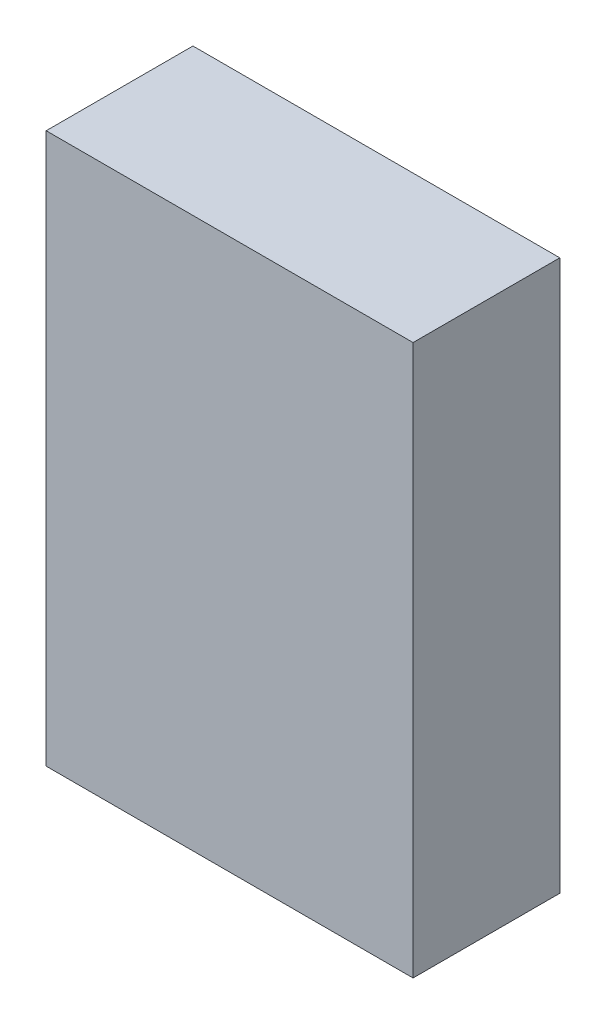
ISO-10303-21;
HEADER;
FILE_DESCRIPTION(('STEP AP214'),'2;1');
FILE_NAME('part.step','',(''),(''),'','','');
FILE_SCHEMA(('AUTOMOTIVE_DESIGN { 1 0 10303 214 1 1 1 1 }'));
ENDSEC;
DATA;
#1=APPLICATION_CONTEXT('core data for automotive mechanical design processes');
#2=APPLICATION_PROTOCOL_DEFINITION('international standard','automotive_design',2000,#1);
#3=PRODUCT_CONTEXT('',#1,'mechanical');
#4=PRODUCT('Part','Part','',(#3));
#5=PRODUCT_RELATED_PRODUCT_CATEGORY('part','',(#4));
#6=PRODUCT_DEFINITION_FORMATION('','',#4);
#7=PRODUCT_DEFINITION_CONTEXT('part definition',#1,'design');
#8=PRODUCT_DEFINITION('design','',#6,#7);
#9=PRODUCT_DEFINITION_SHAPE('','',#8);
#10=(LENGTH_UNIT() NAMED_UNIT(*) SI_UNIT(.MILLI.,.METRE.));
#11=(NAMED_UNIT(*) PLANE_ANGLE_UNIT() SI_UNIT($,.RADIAN.));
#12=(NAMED_UNIT(*) SI_UNIT($,.STERADIAN.) SOLID_ANGLE_UNIT());
#13=UNCERTAINTY_MEASURE_WITH_UNIT(LENGTH_MEASURE(1.E-05),#10,'distance_accuracy_value','');
#14=(GEOMETRIC_REPRESENTATION_CONTEXT(3) GLOBAL_UNCERTAINTY_ASSIGNED_CONTEXT((#13)) GLOBAL_UNIT_ASSIGNED_CONTEXT((#10,
#11,#12)) REPRESENTATION_CONTEXT('',''));
#15=CARTESIAN_POINT('',(0.,0.,0.));
#16=DIRECTION('',(0.,0.,1.));
#17=DIRECTION('',(1.,0.,0.));
#18=AXIS2_PLACEMENT_3D('',#15,#16,#17);
#19=CARTESIAN_POINT('',(-56.6260359487677,31.2883435582822,80.));
#20=DIRECTION('',(1.,0.,0.));
#21=DIRECTION('',(0.,1.,0.));
#22=AXIS2_PLACEMENT_3D('',#19,#20,#21);
#23=PLANE('',#22);
#24=DIRECTION('',(0.,-1.,0.));
#25=VECTOR('',#24,1.);
#26=CARTESIAN_POINT('',(-56.6260359487677,31.2883435582822,0.));
#27=LINE('',#26,#25);
#28=CARTESIAN_POINT('',(-56.6260359487677,31.2883435582822,0.));
#29=VERTEX_POINT('',#28);
#30=CARTESIAN_POINT('',(-56.6260359487677,-268.711656441718,0.));
#31=VERTEX_POINT('',#30);
#32=EDGE_CURVE('E181',#29,#31,#27,.T.);
#33=ORIENTED_EDGE('',*,*,#32,.T.);
#34=DIRECTION('',(0.,0.,-1.));
#35=VECTOR('',#34,1.);
#36=CARTESIAN_POINT('',(-56.6260359487677,-268.711656441718,80.));
#37=LINE('',#36,#35);
#38=CARTESIAN_POINT('',(-56.6260359487677,-268.711656441718,80.));
#39=VERTEX_POINT('',#38);
#40=EDGE_CURVE('E225',#39,#31,#37,.T.);
#41=ORIENTED_EDGE('',*,*,#40,.F.);
#42=DIRECTION('',(0.,-1.,0.));
#43=VECTOR('',#42,1.);
#44=CARTESIAN_POINT('',(-56.6260359487677,31.2883435582822,80.));
#45=LINE('',#44,#43);
#46=CARTESIAN_POINT('',(-56.6260359487677,31.2883435582822,80.));
#47=VERTEX_POINT('',#46);
#48=EDGE_CURVE('E199',#47,#39,#45,.T.);
#49=ORIENTED_EDGE('',*,*,#48,.F.);
#50=DIRECTION('',(0.,0.,-1.));
#51=VECTOR('',#50,1.);
#52=CARTESIAN_POINT('',(-56.6260359487677,31.2883435582822,80.));
#53=LINE('',#52,#51);
#54=EDGE_CURVE('E209',#47,#29,#53,.T.);
#55=ORIENTED_EDGE('',*,*,#54,.T.);
#56=EDGE_LOOP('',(#33,#41,#49,#55));
#57=FACE_BOUND('',#56,.T.);
#58=ADVANCED_FACE('F41',(#57),#23,.F.);
#59=CARTESIAN_POINT('',(-56.6260359487677,-268.711656441718,80.));
#60=DIRECTION('',(0.,1.,0.));
#61=DIRECTION('',(0.,0.,1.));
#62=AXIS2_PLACEMENT_3D('',#59,#60,#61);
#63=PLANE('',#62);
#64=DIRECTION('',(1.,0.,0.));
#65=VECTOR('',#64,1.);
#66=CARTESIAN_POINT('',(-56.6260359487677,-268.711656441718,0.));
#67=LINE('',#66,#65);
#68=CARTESIAN_POINT('',(143.373964051232,-268.711656441718,0.));
#69=VERTEX_POINT('',#68);
#70=EDGE_CURVE('E212',#31,#69,#67,.T.);
#71=ORIENTED_EDGE('',*,*,#70,.T.);
#72=DIRECTION('',(0.,0.,-1.));
#73=VECTOR('',#72,1.);
#74=CARTESIAN_POINT('',(143.373964051232,-268.711656441718,80.));
#75=LINE('',#74,#73);
#76=CARTESIAN_POINT('',(143.373964051232,-268.711656441718,80.));
#77=VERTEX_POINT('',#76);
#78=EDGE_CURVE('E222',#77,#69,#75,.T.);
#79=ORIENTED_EDGE('',*,*,#78,.F.);
#80=DIRECTION('',(1.,0.,0.));
#81=VECTOR('',#80,1.);
#82=CARTESIAN_POINT('',(-56.6260359487677,-268.711656441718,80.));
#83=LINE('',#82,#81);
#84=EDGE_CURVE('E202',#39,#77,#83,.T.);
#85=ORIENTED_EDGE('',*,*,#84,.F.);
#86=ORIENTED_EDGE('',*,*,#40,.T.);
#87=EDGE_LOOP('',(#71,#79,#85,#86));
#88=FACE_BOUND('',#87,.T.);
#89=ADVANCED_FACE('F292',(#88),#63,.F.);
#90=CARTESIAN_POINT('',(143.373964051232,31.2883435582822,80.));
#91=DIRECTION('',(-1.,0.,0.));
#92=DIRECTION('',(0.,-1.,0.));
#93=AXIS2_PLACEMENT_3D('',#90,#91,#92);
#94=PLANE('',#93);
#95=DIRECTION('',(0.,1.,0.));
#96=VECTOR('',#95,1.);
#97=CARTESIAN_POINT('',(143.373964051232,31.2883435582822,0.));
#98=LINE('',#97,#96);
#99=CARTESIAN_POINT('',(143.373964051232,31.2883435582822,0.));
#100=VERTEX_POINT('',#99);
#101=EDGE_CURVE('E214',#69,#100,#98,.T.);
#102=ORIENTED_EDGE('',*,*,#101,.T.);
#103=DIRECTION('',(0.,0.,-1.));
#104=VECTOR('',#103,1.);
#105=CARTESIAN_POINT('',(143.373964051232,31.2883435582822,80.));
#106=LINE('',#105,#104);
#107=CARTESIAN_POINT('',(143.373964051232,31.2883435582822,80.));
#108=VERTEX_POINT('',#107);
#109=EDGE_CURVE('E219',#108,#100,#106,.T.);
#110=ORIENTED_EDGE('',*,*,#109,.F.);
#111=DIRECTION('',(0.,1.,0.));
#112=VECTOR('',#111,1.);
#113=CARTESIAN_POINT('',(143.373964051232,31.2883435582822,80.));
#114=LINE('',#113,#112);
#115=EDGE_CURVE('E205',#77,#108,#114,.T.);
#116=ORIENTED_EDGE('',*,*,#115,.F.);
#117=ORIENTED_EDGE('',*,*,#78,.T.);
#118=EDGE_LOOP('',(#102,#110,#116,#117));
#119=FACE_BOUND('',#118,.T.);
#120=ADVANCED_FACE('F297',(#119),#94,.F.);
#121=CARTESIAN_POINT('',(-56.6260359487677,31.2883435582822,80.));
#122=DIRECTION('',(0.,-1.,0.));
#123=DIRECTION('',(0.,0.,-1.));
#124=AXIS2_PLACEMENT_3D('',#121,#122,#123);
#125=PLANE('',#124);
#126=DIRECTION('',(-1.,0.,0.));
#127=VECTOR('',#126,1.);
#128=CARTESIAN_POINT('',(-56.6260359487677,31.2883435582822,0.));
#129=LINE('',#128,#127);
#130=EDGE_CURVE('E203',#100,#29,#129,.T.);
#131=ORIENTED_EDGE('',*,*,#130,.T.);
#132=ORIENTED_EDGE('',*,*,#54,.F.);
#133=DIRECTION('',(-1.,0.,0.));
#134=VECTOR('',#133,1.);
#135=CARTESIAN_POINT('',(-56.6260359487677,31.2883435582822,80.));
#136=LINE('',#135,#134);
#137=EDGE_CURVE('E207',#108,#47,#136,.T.);
#138=ORIENTED_EDGE('',*,*,#137,.F.);
#139=ORIENTED_EDGE('',*,*,#109,.T.);
#140=EDGE_LOOP('',(#131,#132,#138,#139));
#141=FACE_BOUND('',#140,.T.);
#142=ADVANCED_FACE('F314',(#141),#125,.F.);
#143=CARTESIAN_POINT('',(0.,0.,80.));
#144=DIRECTION('',(0.,0.,1.));
#145=DIRECTION('',(1.,0.,0.));
#146=AXIS2_PLACEMENT_3D('',#143,#144,#145);
#147=PLANE('',#146);
#148=ORIENTED_EDGE('',*,*,#48,.T.);
#149=ORIENTED_EDGE('',*,*,#84,.T.);
#150=ORIENTED_EDGE('',*,*,#115,.T.);
#151=ORIENTED_EDGE('',*,*,#137,.T.);
#152=EDGE_LOOP('',(#148,#149,#150,#151));
#153=FACE_BOUND('',#152,.T.);
#154=ADVANCED_FACE('F310',(#153),#147,.T.);
#155=CARTESIAN_POINT('',(0.,0.,0.));
#156=DIRECTION('',(0.,0.,1.));
#157=DIRECTION('',(1.,0.,0.));
#158=AXIS2_PLACEMENT_3D('',#155,#156,#157);
#159=PLANE('',#158);
#160=DIRECTION('',(0.,1.,0.));
#161=VECTOR('',#160,1.);
#162=CARTESIAN_POINT('',(-54.7260359487677,-266.811656441718,0.));
#163=LINE('',#162,#161);
#164=CARTESIAN_POINT('',(-54.7260359487677,-266.811656441718,0.));
#165=VERTEX_POINT('',#164);
#166=CARTESIAN_POINT('',(-54.7260359487677,29.3883435582822,0.));
#167=VERTEX_POINT('',#166);
#168=EDGE_CURVE('E161',#165,#167,#163,.T.);
#169=ORIENTED_EDGE('',*,*,#168,.F.);
#170=DIRECTION('',(-1.,0.,0.));
#171=VECTOR('',#170,1.);
#172=CARTESIAN_POINT('',(141.473964051232,-266.811656441718,0.));
#173=LINE('',#172,#171);
#174=CARTESIAN_POINT('',(141.473964051232,-266.811656441718,0.));
#175=VERTEX_POINT('',#174);
#176=EDGE_CURVE('E55',#175,#165,#173,.T.);
#177=ORIENTED_EDGE('',*,*,#176,.F.);
#178=DIRECTION('',(0.,-1.,0.));
#179=VECTOR('',#178,1.);
#180=CARTESIAN_POINT('',(141.473964051232,29.3883435582822,0.));
#181=LINE('',#180,#179);
#182=CARTESIAN_POINT('',(141.473964051232,29.3883435582822,0.));
#183=VERTEX_POINT('',#182);
#184=EDGE_CURVE('E149',#183,#175,#181,.T.);
#185=ORIENTED_EDGE('',*,*,#184,.F.);
#186=DIRECTION('',(1.,0.,0.));
#187=VECTOR('',#186,1.);
#188=CARTESIAN_POINT('',(-54.7260359487677,29.3883435582822,0.));
#189=LINE('',#188,#187);
#190=EDGE_CURVE('E152',#167,#183,#189,.T.);
#191=ORIENTED_EDGE('',*,*,#190,.F.);
#192=EDGE_LOOP('',(#169,#177,#185,#191));
#193=FACE_BOUND('',#192,.T.);
#194=ORIENTED_EDGE('',*,*,#32,.F.);
#195=ORIENTED_EDGE('',*,*,#130,.F.);
#196=ORIENTED_EDGE('',*,*,#101,.F.);
#197=ORIENTED_EDGE('',*,*,#70,.F.);
#198=EDGE_LOOP('',(#194,#195,#196,#197));
#199=FACE_BOUND('',#198,.T.);
#200=ADVANCED_FACE('F305',(#193,#199),#159,.F.);
#201=CARTESIAN_POINT('',(141.473964051232,-266.811656441718,4.1));
#202=DIRECTION('',(0.,-1.,0.));
#203=DIRECTION('',(0.,0.,-1.));
#204=AXIS2_PLACEMENT_3D('',#201,#202,#203);
#205=PLANE('',#204);
#206=ORIENTED_EDGE('',*,*,#176,.T.);
#207=DIRECTION('',(0.,0.,-1.));
#208=VECTOR('',#207,1.);
#209=CARTESIAN_POINT('',(-54.7260359487677,-266.811656441718,4.1));
#210=LINE('',#209,#208);
#211=CARTESIAN_POINT('',(-54.7260359487677,-266.811656441718,4.1));
#212=VERTEX_POINT('',#211);
#213=EDGE_CURVE('E127',#212,#165,#210,.T.);
#214=ORIENTED_EDGE('',*,*,#213,.F.);
#215=DIRECTION('',(-1.,0.,0.));
#216=VECTOR('',#215,1.);
#217=CARTESIAN_POINT('',(141.473964051232,-266.811656441718,4.1));
#218=LINE('',#217,#216);
#219=CARTESIAN_POINT('',(141.473964051232,-266.811656441718,4.1));
#220=VERTEX_POINT('',#219);
#221=EDGE_CURVE('E131',#220,#212,#218,.T.);
#222=ORIENTED_EDGE('',*,*,#221,.F.);
#223=DIRECTION('',(0.,0.,-1.));
#224=VECTOR('',#223,1.);
#225=CARTESIAN_POINT('',(141.473964051232,-266.811656441718,4.1));
#226=LINE('',#225,#224);
#227=EDGE_CURVE('E165',#220,#175,#226,.T.);
#228=ORIENTED_EDGE('',*,*,#227,.T.);
#229=EDGE_LOOP('',(#206,#214,#222,#228));
#230=FACE_BOUND('',#229,.T.);
#231=ADVANCED_FACE('F129',(#230),#205,.F.);
#232=CARTESIAN_POINT('',(141.473964051232,29.3883435582822,4.1));
#233=DIRECTION('',(1.,0.,0.));
#234=DIRECTION('',(0.,1.,0.));
#235=AXIS2_PLACEMENT_3D('',#232,#233,#234);
#236=PLANE('',#235);
#237=ORIENTED_EDGE('',*,*,#184,.T.);
#238=ORIENTED_EDGE('',*,*,#227,.F.);
#239=DIRECTION('',(0.,-1.,0.));
#240=VECTOR('',#239,1.);
#241=CARTESIAN_POINT('',(141.473964051232,29.3883435582822,4.1));
#242=LINE('',#241,#240);
#243=CARTESIAN_POINT('',(141.473964051232,29.3883435582822,4.1));
#244=VERTEX_POINT('',#243);
#245=EDGE_CURVE('E137',#244,#220,#242,.T.);
#246=ORIENTED_EDGE('',*,*,#245,.F.);
#247=DIRECTION('',(0.,0.,-1.));
#248=VECTOR('',#247,1.);
#249=CARTESIAN_POINT('',(141.473964051232,29.3883435582822,4.1));
#250=LINE('',#249,#248);
#251=EDGE_CURVE('E167',#244,#183,#250,.T.);
#252=ORIENTED_EDGE('',*,*,#251,.T.);
#253=EDGE_LOOP('',(#237,#238,#246,#252));
#254=FACE_BOUND('',#253,.T.);
#255=ADVANCED_FACE('F342',(#254),#236,.F.);
#256=CARTESIAN_POINT('',(-54.7260359487677,29.3883435582822,4.1));
#257=DIRECTION('',(0.,1.,0.));
#258=DIRECTION('',(0.,0.,1.));
#259=AXIS2_PLACEMENT_3D('',#256,#257,#258);
#260=PLANE('',#259);
#261=ORIENTED_EDGE('',*,*,#190,.T.);
#262=ORIENTED_EDGE('',*,*,#251,.F.);
#263=DIRECTION('',(1.,0.,0.));
#264=VECTOR('',#263,1.);
#265=CARTESIAN_POINT('',(-54.7260359487677,29.3883435582822,4.1));
#266=LINE('',#265,#264);
#267=CARTESIAN_POINT('',(-54.7260359487677,29.3883435582822,4.1));
#268=VERTEX_POINT('',#267);
#269=EDGE_CURVE('E145',#268,#244,#266,.T.);
#270=ORIENTED_EDGE('',*,*,#269,.F.);
#271=DIRECTION('',(0.,0.,-1.));
#272=VECTOR('',#271,1.);
#273=CARTESIAN_POINT('',(-54.7260359487677,29.3883435582822,4.1));
#274=LINE('',#273,#272);
#275=EDGE_CURVE('E136',#268,#167,#274,.T.);
#276=ORIENTED_EDGE('',*,*,#275,.T.);
#277=EDGE_LOOP('',(#261,#262,#270,#276));
#278=FACE_BOUND('',#277,.T.);
#279=ADVANCED_FACE('F350',(#278),#260,.F.);
#280=CARTESIAN_POINT('',(-54.7260359487677,-266.811656441718,4.1));
#281=DIRECTION('',(-1.,0.,0.));
#282=DIRECTION('',(0.,-1.,0.));
#283=AXIS2_PLACEMENT_3D('',#280,#281,#282);
#284=PLANE('',#283);
#285=ORIENTED_EDGE('',*,*,#168,.T.);
#286=ORIENTED_EDGE('',*,*,#275,.F.);
#287=DIRECTION('',(0.,1.,0.));
#288=VECTOR('',#287,1.);
#289=CARTESIAN_POINT('',(-54.7260359487677,-266.811656441718,4.1));
#290=LINE('',#289,#288);
#291=EDGE_CURVE('E140',#212,#268,#290,.T.);
#292=ORIENTED_EDGE('',*,*,#291,.F.);
#293=ORIENTED_EDGE('',*,*,#213,.T.);
#294=EDGE_LOOP('',(#285,#286,#292,#293));
#295=FACE_BOUND('',#294,.T.);
#296=ADVANCED_FACE('F141',(#295),#284,.F.);
#297=CARTESIAN_POINT('',(0.,0.,4.1));
#298=DIRECTION('',(0.,0.,-1.));
#299=DIRECTION('',(-1.,0.,0.));
#300=AXIS2_PLACEMENT_3D('',#297,#298,#299);
#301=PLANE('',#300);
#302=DIRECTION('',(-1.,0.,0.));
#303=VECTOR('',#302,1.);
#304=CARTESIAN_POINT('',(-56.6260359487677,-264.711656441718,4.10000000000001));
#305=LINE('',#304,#303);
#306=CARTESIAN_POINT('',(139.373964051232,-264.711656441718,4.10000000000001));
#307=VERTEX_POINT('',#306);
#308=CARTESIAN_POINT('',(-52.6260359487677,-264.711656441718,4.10000000000001));
#309=VERTEX_POINT('',#308);
#310=EDGE_CURVE('E171',#307,#309,#305,.T.);
#311=ORIENTED_EDGE('',*,*,#310,.F.);
#312=DIRECTION('',(0.,-1.,0.));
#313=VECTOR('',#312,1.);
#314=CARTESIAN_POINT('',(139.373964051232,31.2883435582822,4.10000000000001));
#315=LINE('',#314,#313);
#316=CARTESIAN_POINT('',(139.373964051232,27.2883435582822,4.10000000000001));
#317=VERTEX_POINT('',#316);
#318=EDGE_CURVE('E63',#317,#307,#315,.T.);
#319=ORIENTED_EDGE('',*,*,#318,.F.);
#320=DIRECTION('',(1.,0.,0.));
#321=VECTOR('',#320,1.);
#322=CARTESIAN_POINT('',(-56.6260359487677,27.2883435582822,4.10000000000001));
#323=LINE('',#322,#321);
#324=CARTESIAN_POINT('',(-52.6260359487677,27.2883435582822,4.10000000000001));
#325=VERTEX_POINT('',#324);
#326=EDGE_CURVE('E228',#325,#317,#323,.T.);
#327=ORIENTED_EDGE('',*,*,#326,.F.);
#328=DIRECTION('',(0.,1.,0.));
#329=VECTOR('',#328,1.);
#330=CARTESIAN_POINT('',(-52.6260359487677,31.2883435582822,4.10000000000001));
#331=LINE('',#330,#329);
#332=EDGE_CURVE('E174',#309,#325,#331,.T.);
#333=ORIENTED_EDGE('',*,*,#332,.F.);
#334=EDGE_LOOP('',(#311,#319,#327,#333));
#335=FACE_BOUND('',#334,.T.);
#336=ORIENTED_EDGE('',*,*,#221,.T.);
#337=ORIENTED_EDGE('',*,*,#291,.T.);
#338=ORIENTED_EDGE('',*,*,#269,.T.);
#339=ORIENTED_EDGE('',*,*,#245,.T.);
#340=EDGE_LOOP('',(#336,#337,#338,#339));
#341=FACE_BOUND('',#340,.T.);
#342=ADVANCED_FACE('F147',(#335,#341),#301,.T.);
#343=CARTESIAN_POINT('',(0.,0.,76.));
#344=DIRECTION('',(0.,0.,1.));
#345=DIRECTION('',(1.,0.,0.));
#346=AXIS2_PLACEMENT_3D('',#343,#344,#345);
#347=PLANE('',#346);
#348=CARTESIAN_POINT('',(119.373964051232,-244.711656441718,76.));
#349=DIRECTION('',(0.,0.,1.));
#350=DIRECTION('',(1.,0.,0.));
#351=AXIS2_PLACEMENT_3D('',#348,#349,#350);
#352=CIRCLE('',#351,9.00000000000001);
#353=CARTESIAN_POINT('',(128.373964051232,-244.711656441718,76.));
#354=VERTEX_POINT('',#353);
#355=EDGE_CURVE('E11',#354,#354,#352,.F.);
#356=ORIENTED_EDGE('',*,*,#355,.F.);
#357=EDGE_LOOP('',(#356));
#358=FACE_BOUND('',#357,.T.);
#359=CARTESIAN_POINT('',(-32.6260359487677,-244.711656441718,76.));
#360=DIRECTION('',(0.,0.,1.));
#361=DIRECTION('',(1.,0.,0.));
#362=AXIS2_PLACEMENT_3D('',#359,#360,#361);
#363=CIRCLE('',#362,9.00000000000001);
#364=CARTESIAN_POINT('',(-23.6260359487677,-244.711656441718,76.));
#365=VERTEX_POINT('',#364);
#366=EDGE_CURVE('E48',#365,#365,#363,.F.);
#367=ORIENTED_EDGE('',*,*,#366,.F.);
#368=EDGE_LOOP('',(#367));
#369=FACE_BOUND('',#368,.T.);
#370=CARTESIAN_POINT('',(-32.6260359487677,7.28834355828224,76.));
#371=DIRECTION('',(0.,0.,1.));
#372=DIRECTION('',(1.,0.,0.));
#373=AXIS2_PLACEMENT_3D('',#370,#371,#372);
#374=CIRCLE('',#373,9.);
#375=CARTESIAN_POINT('',(-23.6260359487677,7.28834355828224,76.));
#376=VERTEX_POINT('',#375);
#377=EDGE_CURVE('E245',#376,#376,#374,.F.);
#378=ORIENTED_EDGE('',*,*,#377,.F.);
#379=EDGE_LOOP('',(#378));
#380=FACE_BOUND('',#379,.T.);
#381=CARTESIAN_POINT('',(89.3739640512323,-174.711656441718,76.));
#382=DIRECTION('',(0.,0.,1.));
#383=DIRECTION('',(1.,0.,0.));
#384=AXIS2_PLACEMENT_3D('',#381,#382,#383);
#385=CIRCLE('',#384,9.00000000000001);
#386=CARTESIAN_POINT('',(98.3739640512324,-174.711656441718,76.));
#387=VERTEX_POINT('',#386);
#388=EDGE_CURVE('E242',#387,#387,#385,.F.);
#389=ORIENTED_EDGE('',*,*,#388,.F.);
#390=EDGE_LOOP('',(#389));
#391=FACE_BOUND('',#390,.T.);
#392=CARTESIAN_POINT('',(-2.62603594876769,-62.7116564417177,76.));
#393=DIRECTION('',(0.,0.,1.));
#394=DIRECTION('',(1.,0.,0.));
#395=AXIS2_PLACEMENT_3D('',#392,#393,#394);
#396=CIRCLE('',#395,9.00000000000001);
#397=CARTESIAN_POINT('',(6.37396405123232,-62.7116564417177,76.));
#398=VERTEX_POINT('',#397);
#399=EDGE_CURVE('E239',#398,#398,#396,.F.);
#400=ORIENTED_EDGE('',*,*,#399,.F.);
#401=EDGE_LOOP('',(#400));
#402=FACE_BOUND('',#401,.T.);
#403=CARTESIAN_POINT('',(-2.62603594876769,-174.711656441718,76.));
#404=DIRECTION('',(0.,0.,1.));
#405=DIRECTION('',(1.,0.,0.));
#406=AXIS2_PLACEMENT_3D('',#403,#404,#405);
#407=CIRCLE('',#406,9.00000000000002);
#408=CARTESIAN_POINT('',(6.37396405123233,-174.711656441718,76.));
#409=VERTEX_POINT('',#408);
#410=EDGE_CURVE('E236',#409,#409,#407,.F.);
#411=ORIENTED_EDGE('',*,*,#410,.F.);
#412=EDGE_LOOP('',(#411));
#413=FACE_BOUND('',#412,.T.);
#414=CARTESIAN_POINT('',(89.3739640512323,-62.7116564417177,76.));
#415=DIRECTION('',(0.,0.,1.));
#416=DIRECTION('',(1.,0.,0.));
#417=AXIS2_PLACEMENT_3D('',#414,#415,#416);
#418=CIRCLE('',#417,9.00000000000001);
#419=CARTESIAN_POINT('',(98.3739640512324,-62.7116564417177,76.));
#420=VERTEX_POINT('',#419);
#421=EDGE_CURVE('E233',#420,#420,#418,.F.);
#422=ORIENTED_EDGE('',*,*,#421,.F.);
#423=EDGE_LOOP('',(#422));
#424=FACE_BOUND('',#423,.T.);
#425=CARTESIAN_POINT('',(119.373964051232,7.28834355828225,76.));
#426=DIRECTION('',(0.,0.,1.));
#427=DIRECTION('',(1.,0.,0.));
#428=AXIS2_PLACEMENT_3D('',#425,#426,#427);
#429=CIRCLE('',#428,9.00000000000001);
#430=CARTESIAN_POINT('',(128.373964051232,7.28834355828225,76.));
#431=VERTEX_POINT('',#430);
#432=EDGE_CURVE('E230',#431,#431,#429,.F.);
#433=ORIENTED_EDGE('',*,*,#432,.F.);
#434=EDGE_LOOP('',(#433));
#435=FACE_BOUND('',#434,.T.);
#436=DIRECTION('',(0.,-1.,0.));
#437=VECTOR('',#436,1.);
#438=CARTESIAN_POINT('',(-52.6260359487677,31.2883435582822,76.));
#439=LINE('',#438,#437);
#440=CARTESIAN_POINT('',(-52.6260359487677,27.2883435582822,76.));
#441=VERTEX_POINT('',#440);
#442=CARTESIAN_POINT('',(-52.6260359487677,-264.711656441718,76.));
#443=VERTEX_POINT('',#442);
#444=EDGE_CURVE('E177',#441,#443,#439,.T.);
#445=ORIENTED_EDGE('',*,*,#444,.F.);
#446=DIRECTION('',(-1.,0.,0.));
#447=VECTOR('',#446,1.);
#448=CARTESIAN_POINT('',(-56.6260359487677,27.2883435582822,76.));
#449=LINE('',#448,#447);
#450=CARTESIAN_POINT('',(139.373964051232,27.2883435582822,76.));
#451=VERTEX_POINT('',#450);
#452=EDGE_CURVE('E190',#451,#441,#449,.T.);
#453=ORIENTED_EDGE('',*,*,#452,.F.);
#454=DIRECTION('',(0.,1.,0.));
#455=VECTOR('',#454,1.);
#456=CARTESIAN_POINT('',(139.373964051232,31.2883435582822,76.));
#457=LINE('',#456,#455);
#458=CARTESIAN_POINT('',(139.373964051232,-264.711656441718,76.));
#459=VERTEX_POINT('',#458);
#460=EDGE_CURVE('E194',#459,#451,#457,.T.);
#461=ORIENTED_EDGE('',*,*,#460,.F.);
#462=DIRECTION('',(1.,0.,0.));
#463=VECTOR('',#462,1.);
#464=CARTESIAN_POINT('',(-56.6260359487677,-264.711656441718,76.));
#465=LINE('',#464,#463);
#466=EDGE_CURVE('E185',#443,#459,#465,.T.);
#467=ORIENTED_EDGE('',*,*,#466,.F.);
#468=EDGE_LOOP('',(#445,#453,#461,#467));
#469=FACE_BOUND('',#468,.T.);
#470=ADVANCED_FACE('F252',(#358,#369,#380,#391,#402,#413,#424,#435,#469),#347,.F.);
#471=CARTESIAN_POINT('',(-56.6260359487677,27.2883435582822,80.));
#472=DIRECTION('',(0.,-1.,0.));
#473=DIRECTION('',(0.,0.,-1.));
#474=AXIS2_PLACEMENT_3D('',#471,#472,#473);
#475=PLANE('',#474);
#476=DIRECTION('',(0.,0.,-1.));
#477=VECTOR('',#476,1.);
#478=CARTESIAN_POINT('',(-52.6260359487677,27.2883435582822,80.));
#479=LINE('',#478,#477);
#480=EDGE_CURVE('E186',#441,#325,#479,.T.);
#481=ORIENTED_EDGE('',*,*,#480,.T.);
#482=ORIENTED_EDGE('',*,*,#326,.T.);
#483=DIRECTION('',(0.,0.,-1.));
#484=VECTOR('',#483,1.);
#485=CARTESIAN_POINT('',(139.373964051232,27.2883435582822,80.));
#486=LINE('',#485,#484);
#487=EDGE_CURVE('E189',#451,#317,#486,.T.);
#488=ORIENTED_EDGE('',*,*,#487,.F.);
#489=ORIENTED_EDGE('',*,*,#452,.T.);
#490=EDGE_LOOP('',(#481,#482,#488,#489));
#491=FACE_BOUND('',#490,.T.);
#492=ADVANCED_FACE('F255',(#491),#475,.T.);
#493=CARTESIAN_POINT('',(139.373964051232,31.2883435582822,80.));
#494=DIRECTION('',(-1.,0.,0.));
#495=DIRECTION('',(0.,-1.,0.));
#496=AXIS2_PLACEMENT_3D('',#493,#494,#495);
#497=PLANE('',#496);
#498=ORIENTED_EDGE('',*,*,#487,.T.);
#499=ORIENTED_EDGE('',*,*,#318,.T.);
#500=DIRECTION('',(0.,0.,-1.));
#501=VECTOR('',#500,1.);
#502=CARTESIAN_POINT('',(139.373964051232,-264.711656441718,80.));
#503=LINE('',#502,#501);
#504=EDGE_CURVE('E182',#459,#307,#503,.T.);
#505=ORIENTED_EDGE('',*,*,#504,.F.);
#506=ORIENTED_EDGE('',*,*,#460,.T.);
#507=EDGE_LOOP('',(#498,#499,#505,#506));
#508=FACE_BOUND('',#507,.T.);
#509=ADVANCED_FACE('F281',(#508),#497,.T.);
#510=CARTESIAN_POINT('',(-56.6260359487677,-264.711656441718,80.));
#511=DIRECTION('',(0.,1.,0.));
#512=DIRECTION('',(0.,0.,1.));
#513=AXIS2_PLACEMENT_3D('',#510,#511,#512);
#514=PLANE('',#513);
#515=ORIENTED_EDGE('',*,*,#504,.T.);
#516=ORIENTED_EDGE('',*,*,#310,.T.);
#517=DIRECTION('',(0.,0.,-1.));
#518=VECTOR('',#517,1.);
#519=CARTESIAN_POINT('',(-52.6260359487677,-264.711656441718,80.));
#520=LINE('',#519,#518);
#521=EDGE_CURVE('E178',#443,#309,#520,.T.);
#522=ORIENTED_EDGE('',*,*,#521,.F.);
#523=ORIENTED_EDGE('',*,*,#466,.T.);
#524=EDGE_LOOP('',(#515,#516,#522,#523));
#525=FACE_BOUND('',#524,.T.);
#526=ADVANCED_FACE('F278',(#525),#514,.T.);
#527=CARTESIAN_POINT('',(-52.6260359487677,31.2883435582822,80.));
#528=DIRECTION('',(1.,0.,0.));
#529=DIRECTION('',(0.,1.,0.));
#530=AXIS2_PLACEMENT_3D('',#527,#528,#529);
#531=PLANE('',#530);
#532=ORIENTED_EDGE('',*,*,#521,.T.);
#533=ORIENTED_EDGE('',*,*,#332,.T.);
#534=ORIENTED_EDGE('',*,*,#480,.F.);
#535=ORIENTED_EDGE('',*,*,#444,.T.);
#536=EDGE_LOOP('',(#532,#533,#534,#535));
#537=FACE_BOUND('',#536,.T.);
#538=ADVANCED_FACE('F276',(#537),#531,.T.);
#539=CARTESIAN_POINT('',(119.373964051232,7.28834355828225,8.1));
#540=DIRECTION('',(0.,0.,1.));
#541=DIRECTION('',(1.,0.,0.));
#542=AXIS2_PLACEMENT_3D('',#539,#540,#541);
#543=CYLINDRICAL_SURFACE('',#542,9.00000000000001);
#544=CARTESIAN_POINT('',(119.373964051232,7.28834355828225,8.1));
#545=DIRECTION('',(0.,0.,-1.));
#546=DIRECTION('',(-1.,0.,0.));
#547=AXIS2_PLACEMENT_3D('',#544,#545,#546);
#548=CIRCLE('',#547,9.00000000000001);
#549=CARTESIAN_POINT('',(110.373964051232,7.28834355828225,8.1));
#550=VERTEX_POINT('',#549);
#551=EDGE_CURVE('E155',#550,#550,#548,.T.);
#552=ORIENTED_EDGE('',*,*,#551,.F.);
#553=EDGE_LOOP('',(#552));
#554=FACE_BOUND('',#553,.T.);
#555=ORIENTED_EDGE('',*,*,#432,.T.);
#556=EDGE_LOOP('',(#555));
#557=FACE_BOUND('',#556,.T.);
#558=ADVANCED_FACE('F373',(#554,#557),#543,.T.);
#559=CARTESIAN_POINT('',(119.373964051232,7.28834355828225,8.1));
#560=DIRECTION('',(0.,0.,-1.));
#561=DIRECTION('',(-1.,0.,0.));
#562=AXIS2_PLACEMENT_3D('',#559,#560,#561);
#563=PLANE('',#562);
#564=CARTESIAN_POINT('',(119.373964051232,7.28834355828225,8.1));
#565=DIRECTION('',(0.,0.,-1.));
#566=DIRECTION('',(-1.,0.,0.));
#567=AXIS2_PLACEMENT_3D('',#564,#565,#566);
#568=CIRCLE('',#567,2.50000000000001);
#569=CARTESIAN_POINT('',(116.873964051232,7.28834355828225,8.1));
#570=VERTEX_POINT('',#569);
#571=EDGE_CURVE('E779',#570,#570,#568,.T.);
#572=ORIENTED_EDGE('',*,*,#571,.F.);
#573=EDGE_LOOP('',(#572));
#574=FACE_BOUND('',#573,.T.);
#575=ORIENTED_EDGE('',*,*,#551,.T.);
#576=EDGE_LOOP('',(#575));
#577=FACE_BOUND('',#576,.T.);
#578=ADVANCED_FACE('F379',(#574,#577),#563,.T.);
#579=CARTESIAN_POINT('',(119.373964051232,7.28834355828225,38.1));
#580=DIRECTION('',(0.,0.,-1.));
#581=DIRECTION('',(-1.,0.,0.));
#582=AXIS2_PLACEMENT_3D('',#579,#580,#581);
#583=CYLINDRICAL_SURFACE('',#582,2.50000000000001);
#584=CARTESIAN_POINT('',(119.373964051232,7.28834355828225,38.1));
#585=DIRECTION('',(0.,0.,-1.));
#586=DIRECTION('',(-1.,0.,0.));
#587=AXIS2_PLACEMENT_3D('',#584,#585,#586);
#588=CIRCLE('',#587,2.50000000000001);
#589=CARTESIAN_POINT('',(116.873964051232,7.28834355828225,38.1));
#590=VERTEX_POINT('',#589);
#591=EDGE_CURVE('E780',#590,#590,#588,.T.);
#592=ORIENTED_EDGE('',*,*,#591,.F.);
#593=EDGE_LOOP('',(#592));
#594=FACE_BOUND('',#593,.T.);
#595=ORIENTED_EDGE('',*,*,#571,.T.);
#596=EDGE_LOOP('',(#595));
#597=FACE_BOUND('',#596,.T.);
#598=ADVANCED_FACE('F390',(#594,#597),#583,.F.);
#599=CARTESIAN_POINT('',(119.373964051232,7.28834355828225,38.1));
#600=DIRECTION('',(0.,0.,-1.));
#601=DIRECTION('',(-1.,0.,0.));
#602=AXIS2_PLACEMENT_3D('',#599,#600,#601);
#603=PLANE('',#602);
#604=ORIENTED_EDGE('',*,*,#591,.T.);
#605=EDGE_LOOP('',(#604));
#606=FACE_BOUND('',#605,.T.);
#607=ADVANCED_FACE('F400',(#606),#603,.T.);
#608=CARTESIAN_POINT('',(89.3739640512323,-62.7116564417177,61.));
#609=DIRECTION('',(0.,0.,1.));
#610=DIRECTION('',(1.,0.,0.));
#611=AXIS2_PLACEMENT_3D('',#608,#609,#610);
#612=CYLINDRICAL_SURFACE('',#611,9.00000000000001);
#613=CARTESIAN_POINT('',(89.3739640512323,-62.7116564417177,61.));
#614=DIRECTION('',(0.,0.,-1.));
#615=DIRECTION('',(-1.,0.,0.));
#616=AXIS2_PLACEMENT_3D('',#613,#614,#615);
#617=CIRCLE('',#616,9.00000000000001);
#618=CARTESIAN_POINT('',(80.3739640512323,-62.7116564417177,61.));
#619=VERTEX_POINT('',#618);
#620=EDGE_CURVE('E776',#619,#619,#617,.T.);
#621=ORIENTED_EDGE('',*,*,#620,.F.);
#622=EDGE_LOOP('',(#621));
#623=FACE_BOUND('',#622,.T.);
#624=ORIENTED_EDGE('',*,*,#421,.T.);
#625=EDGE_LOOP('',(#624));
#626=FACE_BOUND('',#625,.T.);
#627=ADVANCED_FACE('F410',(#623,#626),#612,.T.);
#628=CARTESIAN_POINT('',(0.,0.,61.));
#629=DIRECTION('',(0.,0.,-1.));
#630=DIRECTION('',(-1.,0.,0.));
#631=AXIS2_PLACEMENT_3D('',#628,#629,#630);
#632=PLANE('',#631);
#633=CARTESIAN_POINT('',(89.3739640512323,-62.7116564417177,61.));
#634=DIRECTION('',(0.,0.,-1.));
#635=DIRECTION('',(-1.,0.,0.));
#636=AXIS2_PLACEMENT_3D('',#633,#634,#635);
#637=CIRCLE('',#636,2.5);
#638=CARTESIAN_POINT('',(86.8739640512323,-62.7116564417177,61.));
#639=VERTEX_POINT('',#638);
#640=EDGE_CURVE('E753',#639,#639,#637,.T.);
#641=ORIENTED_EDGE('',*,*,#640,.F.);
#642=EDGE_LOOP('',(#641));
#643=FACE_BOUND('',#642,.T.);
#644=ORIENTED_EDGE('',*,*,#620,.T.);
#645=EDGE_LOOP('',(#644));
#646=FACE_BOUND('',#645,.T.);
#647=ADVANCED_FACE('F420',(#643,#646),#632,.T.);
#648=CARTESIAN_POINT('',(-2.62603594876769,-174.711656441718,61.));
#649=DIRECTION('',(0.,0.,1.));
#650=DIRECTION('',(1.,0.,0.));
#651=AXIS2_PLACEMENT_3D('',#648,#649,#650);
#652=CYLINDRICAL_SURFACE('',#651,9.00000000000002);
#653=CARTESIAN_POINT('',(-2.62603594876769,-174.711656441718,61.));
#654=DIRECTION('',(0.,0.,-1.));
#655=DIRECTION('',(-1.,0.,0.));
#656=AXIS2_PLACEMENT_3D('',#653,#654,#655);
#657=CIRCLE('',#656,9.00000000000002);
#658=CARTESIAN_POINT('',(-11.6260359487677,-174.711656441718,61.));
#659=VERTEX_POINT('',#658);
#660=EDGE_CURVE('E773',#659,#659,#657,.T.);
#661=ORIENTED_EDGE('',*,*,#660,.F.);
#662=EDGE_LOOP('',(#661));
#663=FACE_BOUND('',#662,.T.);
#664=ORIENTED_EDGE('',*,*,#410,.T.);
#665=EDGE_LOOP('',(#664));
#666=FACE_BOUND('',#665,.T.);
#667=ADVANCED_FACE('F431',(#663,#666),#652,.T.);
#668=CARTESIAN_POINT('',(0.,0.,61.));
#669=DIRECTION('',(0.,0.,-1.));
#670=DIRECTION('',(-1.,0.,0.));
#671=AXIS2_PLACEMENT_3D('',#668,#669,#670);
#672=PLANE('',#671);
#673=CARTESIAN_POINT('',(-2.62603594876769,-174.711656441718,61.));
#674=DIRECTION('',(0.,0.,-1.));
#675=DIRECTION('',(-1.,0.,0.));
#676=AXIS2_PLACEMENT_3D('',#673,#674,#675);
#677=CIRCLE('',#676,2.50000000000001);
#678=CARTESIAN_POINT('',(-5.1260359487677,-174.711656441718,61.));
#679=VERTEX_POINT('',#678);
#680=EDGE_CURVE('E743',#679,#679,#677,.T.);
#681=ORIENTED_EDGE('',*,*,#680,.F.);
#682=EDGE_LOOP('',(#681));
#683=FACE_BOUND('',#682,.T.);
#684=ORIENTED_EDGE('',*,*,#660,.T.);
#685=EDGE_LOOP('',(#684));
#686=FACE_BOUND('',#685,.T.);
#687=ADVANCED_FACE('F445',(#683,#686),#672,.T.);
#688=CARTESIAN_POINT('',(-2.62603594876769,-62.7116564417177,61.));
#689=DIRECTION('',(0.,0.,1.));
#690=DIRECTION('',(1.,0.,0.));
#691=AXIS2_PLACEMENT_3D('',#688,#689,#690);
#692=CYLINDRICAL_SURFACE('',#691,9.00000000000001);
#693=CARTESIAN_POINT('',(-2.62603594876769,-62.7116564417177,61.));
#694=DIRECTION('',(0.,0.,-1.));
#695=DIRECTION('',(-1.,0.,0.));
#696=AXIS2_PLACEMENT_3D('',#693,#694,#695);
#697=CIRCLE('',#696,9.00000000000001);
#698=CARTESIAN_POINT('',(-11.6260359487677,-62.7116564417177,61.));
#699=VERTEX_POINT('',#698);
#700=EDGE_CURVE('E770',#699,#699,#697,.T.);
#701=ORIENTED_EDGE('',*,*,#700,.F.);
#702=EDGE_LOOP('',(#701));
#703=FACE_BOUND('',#702,.T.);
#704=ORIENTED_EDGE('',*,*,#399,.T.);
#705=EDGE_LOOP('',(#704));
#706=FACE_BOUND('',#705,.T.);
#707=ADVANCED_FACE('F455',(#703,#706),#692,.T.);
#708=CARTESIAN_POINT('',(-2.62603594876769,-62.7116564417177,61.));
#709=DIRECTION('',(0.,0.,-1.));
#710=DIRECTION('',(-1.,0.,0.));
#711=AXIS2_PLACEMENT_3D('',#708,#709,#710);
#712=PLANE('',#711);
#713=CARTESIAN_POINT('',(-2.62603594876769,-62.7116564417177,61.));
#714=DIRECTION('',(0.,0.,-1.));
#715=DIRECTION('',(-1.,0.,0.));
#716=AXIS2_PLACEMENT_3D('',#713,#714,#715);
#717=CIRCLE('',#716,2.50000000000001);
#718=CARTESIAN_POINT('',(-5.1260359487677,-62.7116564417177,61.));
#719=VERTEX_POINT('',#718);
#720=EDGE_CURVE('E754',#719,#719,#717,.T.);
#721=ORIENTED_EDGE('',*,*,#720,.F.);
#722=EDGE_LOOP('',(#721));
#723=FACE_BOUND('',#722,.T.);
#724=ORIENTED_EDGE('',*,*,#700,.T.);
#725=EDGE_LOOP('',(#724));
#726=FACE_BOUND('',#725,.T.);
#727=ADVANCED_FACE('F468',(#723,#726),#712,.T.);
#728=CARTESIAN_POINT('',(89.3739640512323,-174.711656441718,61.));
#729=DIRECTION('',(0.,0.,1.));
#730=DIRECTION('',(1.,0.,0.));
#731=AXIS2_PLACEMENT_3D('',#728,#729,#730);
#732=CYLINDRICAL_SURFACE('',#731,9.00000000000001);
#733=CARTESIAN_POINT('',(89.3739640512323,-174.711656441718,61.));
#734=DIRECTION('',(0.,0.,-1.));
#735=DIRECTION('',(-1.,0.,0.));
#736=AXIS2_PLACEMENT_3D('',#733,#734,#735);
#737=CIRCLE('',#736,9.00000000000001);
#738=CARTESIAN_POINT('',(80.3739640512323,-174.711656441718,61.));
#739=VERTEX_POINT('',#738);
#740=EDGE_CURVE('E765',#739,#739,#737,.T.);
#741=ORIENTED_EDGE('',*,*,#740,.F.);
#742=EDGE_LOOP('',(#741));
#743=FACE_BOUND('',#742,.T.);
#744=ORIENTED_EDGE('',*,*,#388,.T.);
#745=EDGE_LOOP('',(#744));
#746=FACE_BOUND('',#745,.T.);
#747=ADVANCED_FACE('F477',(#743,#746),#732,.T.);
#748=CARTESIAN_POINT('',(89.3739640512323,-174.711656441718,61.));
#749=DIRECTION('',(0.,0.,-1.));
#750=DIRECTION('',(-1.,0.,0.));
#751=AXIS2_PLACEMENT_3D('',#748,#749,#750);
#752=PLANE('',#751);
#753=CARTESIAN_POINT('',(89.3739640512323,-174.711656441718,61.));
#754=DIRECTION('',(0.,0.,-1.));
#755=DIRECTION('',(-1.,0.,0.));
#756=AXIS2_PLACEMENT_3D('',#753,#754,#755);
#757=CIRCLE('',#756,2.5);
#758=CARTESIAN_POINT('',(86.8739640512323,-174.711656441718,61.));
#759=VERTEX_POINT('',#758);
#760=EDGE_CURVE('E747',#759,#759,#757,.T.);
#761=ORIENTED_EDGE('',*,*,#760,.F.);
#762=EDGE_LOOP('',(#761));
#763=FACE_BOUND('',#762,.T.);
#764=ORIENTED_EDGE('',*,*,#740,.T.);
#765=EDGE_LOOP('',(#764));
#766=FACE_BOUND('',#765,.T.);
#767=ADVANCED_FACE('F487',(#763,#766),#752,.T.);
#768=CARTESIAN_POINT('',(89.3739640512323,-174.711656441718,71.));
#769=DIRECTION('',(0.,0.,-1.));
#770=DIRECTION('',(-1.,0.,0.));
#771=AXIS2_PLACEMENT_3D('',#768,#769,#770);
#772=CYLINDRICAL_SURFACE('',#771,2.5);
#773=CARTESIAN_POINT('',(89.3739640512323,-174.711656441718,71.));
#774=DIRECTION('',(0.,0.,-1.));
#775=DIRECTION('',(-1.,0.,0.));
#776=AXIS2_PLACEMENT_3D('',#773,#774,#775);
#777=CIRCLE('',#776,2.5);
#778=CARTESIAN_POINT('',(86.8739640512323,-174.711656441718,71.));
#779=VERTEX_POINT('',#778);
#780=EDGE_CURVE('E757',#779,#779,#777,.T.);
#781=ORIENTED_EDGE('',*,*,#780,.F.);
#782=EDGE_LOOP('',(#781));
#783=FACE_BOUND('',#782,.T.);
#784=ORIENTED_EDGE('',*,*,#760,.T.);
#785=EDGE_LOOP('',(#784));
#786=FACE_BOUND('',#785,.T.);
#787=ADVANCED_FACE('F496',(#783,#786),#772,.F.);
#788=CARTESIAN_POINT('',(89.3739640512323,-174.711656441718,71.));
#789=DIRECTION('',(0.,0.,-1.));
#790=DIRECTION('',(-1.,0.,0.));
#791=AXIS2_PLACEMENT_3D('',#788,#789,#790);
#792=PLANE('',#791);
#793=ORIENTED_EDGE('',*,*,#780,.T.);
#794=EDGE_LOOP('',(#793));
#795=FACE_BOUND('',#794,.T.);
#796=ADVANCED_FACE('F506',(#795),#792,.T.);
#797=CARTESIAN_POINT('',(-2.62603594876769,-62.7116564417177,71.));
#798=DIRECTION('',(0.,0.,-1.));
#799=DIRECTION('',(-1.,0.,0.));
#800=AXIS2_PLACEMENT_3D('',#797,#798,#799);
#801=CYLINDRICAL_SURFACE('',#800,2.50000000000001);
#802=CARTESIAN_POINT('',(-2.62603594876769,-62.7116564417177,71.));
#803=DIRECTION('',(0.,0.,-1.));
#804=DIRECTION('',(-1.,0.,0.));
#805=AXIS2_PLACEMENT_3D('',#802,#803,#804);
#806=CIRCLE('',#805,2.50000000000001);
#807=CARTESIAN_POINT('',(-5.1260359487677,-62.7116564417177,71.));
#808=VERTEX_POINT('',#807);
#809=EDGE_CURVE('E750',#808,#808,#806,.T.);
#810=ORIENTED_EDGE('',*,*,#809,.F.);
#811=EDGE_LOOP('',(#810));
#812=FACE_BOUND('',#811,.T.);
#813=ORIENTED_EDGE('',*,*,#720,.T.);
#814=EDGE_LOOP('',(#813));
#815=FACE_BOUND('',#814,.T.);
#816=ADVANCED_FACE('F516',(#812,#815),#801,.F.);
#817=CARTESIAN_POINT('',(-2.62603594876769,-62.7116564417177,71.));
#818=DIRECTION('',(0.,0.,-1.));
#819=DIRECTION('',(-1.,0.,0.));
#820=AXIS2_PLACEMENT_3D('',#817,#818,#819);
#821=PLANE('',#820);
#822=ORIENTED_EDGE('',*,*,#809,.T.);
#823=EDGE_LOOP('',(#822));
#824=FACE_BOUND('',#823,.T.);
#825=ADVANCED_FACE('F526',(#824),#821,.T.);
#826=CARTESIAN_POINT('',(-2.62603594876769,-174.711656441718,71.));
#827=DIRECTION('',(0.,0.,-1.));
#828=DIRECTION('',(-1.,0.,0.));
#829=AXIS2_PLACEMENT_3D('',#826,#827,#828);
#830=CYLINDRICAL_SURFACE('',#829,2.50000000000001);
#831=CARTESIAN_POINT('',(-2.62603594876769,-174.711656441718,71.));
#832=DIRECTION('',(0.,0.,-1.));
#833=DIRECTION('',(-1.,0.,0.));
#834=AXIS2_PLACEMENT_3D('',#831,#832,#833);
#835=CIRCLE('',#834,2.50000000000001);
#836=CARTESIAN_POINT('',(-5.1260359487677,-174.711656441718,71.));
#837=VERTEX_POINT('',#836);
#838=EDGE_CURVE('E744',#837,#837,#835,.T.);
#839=ORIENTED_EDGE('',*,*,#838,.F.);
#840=EDGE_LOOP('',(#839));
#841=FACE_BOUND('',#840,.T.);
#842=ORIENTED_EDGE('',*,*,#680,.T.);
#843=EDGE_LOOP('',(#842));
#844=FACE_BOUND('',#843,.T.);
#845=ADVANCED_FACE('F536',(#841,#844),#830,.F.);
#846=CARTESIAN_POINT('',(-2.62603594876769,-174.711656441718,71.));
#847=DIRECTION('',(0.,0.,-1.));
#848=DIRECTION('',(-1.,0.,0.));
#849=AXIS2_PLACEMENT_3D('',#846,#847,#848);
#850=PLANE('',#849);
#851=ORIENTED_EDGE('',*,*,#838,.T.);
#852=EDGE_LOOP('',(#851));
#853=FACE_BOUND('',#852,.T.);
#854=ADVANCED_FACE('F546',(#853),#850,.T.);
#855=CARTESIAN_POINT('',(89.3739640512323,-62.7116564417177,71.));
#856=DIRECTION('',(0.,0.,-1.));
#857=DIRECTION('',(-1.,0.,0.));
#858=AXIS2_PLACEMENT_3D('',#855,#856,#857);
#859=CYLINDRICAL_SURFACE('',#858,2.5);
#860=CARTESIAN_POINT('',(89.3739640512323,-62.7116564417177,71.));
#861=DIRECTION('',(0.,0.,-1.));
#862=DIRECTION('',(-1.,0.,0.));
#863=AXIS2_PLACEMENT_3D('',#860,#861,#862);
#864=CIRCLE('',#863,2.5);
#865=CARTESIAN_POINT('',(86.8739640512323,-62.7116564417177,71.));
#866=VERTEX_POINT('',#865);
#867=EDGE_CURVE('E762',#866,#866,#864,.T.);
#868=ORIENTED_EDGE('',*,*,#867,.F.);
#869=EDGE_LOOP('',(#868));
#870=FACE_BOUND('',#869,.T.);
#871=ORIENTED_EDGE('',*,*,#640,.T.);
#872=EDGE_LOOP('',(#871));
#873=FACE_BOUND('',#872,.T.);
#874=ADVANCED_FACE('F556',(#870,#873),#859,.F.);
#875=CARTESIAN_POINT('',(89.3739640512323,-62.7116564417177,71.));
#876=DIRECTION('',(0.,0.,-1.));
#877=DIRECTION('',(-1.,0.,0.));
#878=AXIS2_PLACEMENT_3D('',#875,#876,#877);
#879=PLANE('',#878);
#880=ORIENTED_EDGE('',*,*,#867,.T.);
#881=EDGE_LOOP('',(#880));
#882=FACE_BOUND('',#881,.T.);
#883=ADVANCED_FACE('F566',(#882),#879,.T.);
#884=CARTESIAN_POINT('',(-32.6260359487677,7.28834355828224,7.99999999999999));
#885=DIRECTION('',(0.,0.,1.));
#886=DIRECTION('',(1.,0.,0.));
#887=AXIS2_PLACEMENT_3D('',#884,#885,#886);
#888=CYLINDRICAL_SURFACE('',#887,9.);
#889=CARTESIAN_POINT('',(-32.6260359487677,7.28834355828224,7.99999999999999));
#890=DIRECTION('',(0.,0.,-1.));
#891=DIRECTION('',(-1.,0.,0.));
#892=AXIS2_PLACEMENT_3D('',#889,#890,#891);
#893=CIRCLE('',#892,9.);
#894=CARTESIAN_POINT('',(-41.6260359487677,7.28834355828224,7.99999999999999));
#895=VERTEX_POINT('',#894);
#896=EDGE_CURVE('E740',#895,#895,#893,.T.);
#897=ORIENTED_EDGE('',*,*,#896,.F.);
#898=EDGE_LOOP('',(#897));
#899=FACE_BOUND('',#898,.T.);
#900=ORIENTED_EDGE('',*,*,#377,.T.);
#901=EDGE_LOOP('',(#900));
#902=FACE_BOUND('',#901,.T.);
#903=ADVANCED_FACE('F576',(#899,#902),#888,.T.);
#904=CARTESIAN_POINT('',(0.,0.,7.99999999999999));
#905=DIRECTION('',(0.,0.,-1.));
#906=DIRECTION('',(-1.,0.,0.));
#907=AXIS2_PLACEMENT_3D('',#904,#905,#906);
#908=PLANE('',#907);
#909=CARTESIAN_POINT('',(-32.6260359487677,7.28834355828224,7.99999999999999));
#910=DIRECTION('',(0.,0.,-1.));
#911=DIRECTION('',(-1.,0.,0.));
#912=AXIS2_PLACEMENT_3D('',#909,#910,#911);
#913=CIRCLE('',#912,2.5);
#914=CARTESIAN_POINT('',(-35.1260359487677,7.28834355828224,7.99999999999999));
#915=VERTEX_POINT('',#914);
#916=EDGE_CURVE('E726',#915,#915,#913,.T.);
#917=ORIENTED_EDGE('',*,*,#916,.F.);
#918=EDGE_LOOP('',(#917));
#919=FACE_BOUND('',#918,.T.);
#920=ORIENTED_EDGE('',*,*,#896,.T.);
#921=EDGE_LOOP('',(#920));
#922=FACE_BOUND('',#921,.T.);
#923=ADVANCED_FACE('F586',(#919,#922),#908,.T.);
#924=CARTESIAN_POINT('',(-32.6260359487677,-244.711656441718,7.99999999999999));
#925=DIRECTION('',(0.,0.,1.));
#926=DIRECTION('',(1.,0.,0.));
#927=AXIS2_PLACEMENT_3D('',#924,#925,#926);
#928=CYLINDRICAL_SURFACE('',#927,9.00000000000001);
#929=CARTESIAN_POINT('',(-32.6260359487677,-244.711656441718,7.99999999999999));
#930=DIRECTION('',(0.,0.,-1.));
#931=DIRECTION('',(-1.,0.,0.));
#932=AXIS2_PLACEMENT_3D('',#929,#930,#931);
#933=CIRCLE('',#932,9.00000000000001);
#934=CARTESIAN_POINT('',(-41.6260359487677,-244.711656441718,7.99999999999999));
#935=VERTEX_POINT('',#934);
#936=EDGE_CURVE('E736',#935,#935,#933,.T.);
#937=ORIENTED_EDGE('',*,*,#936,.F.);
#938=EDGE_LOOP('',(#937));
#939=FACE_BOUND('',#938,.T.);
#940=ORIENTED_EDGE('',*,*,#366,.T.);
#941=EDGE_LOOP('',(#940));
#942=FACE_BOUND('',#941,.T.);
#943=ADVANCED_FACE('F250',(#939,#942),#928,.T.);
#944=CARTESIAN_POINT('',(0.,0.,7.99999999999999));
#945=DIRECTION('',(0.,0.,-1.));
#946=DIRECTION('',(-1.,0.,0.));
#947=AXIS2_PLACEMENT_3D('',#944,#945,#946);
#948=PLANE('',#947);
#949=CARTESIAN_POINT('',(-32.6260359487677,-244.711656441718,7.99999999999999));
#950=DIRECTION('',(0.,0.,-1.));
#951=DIRECTION('',(-1.,0.,0.));
#952=AXIS2_PLACEMENT_3D('',#949,#950,#951);
#953=CIRCLE('',#952,2.50000000000001);
#954=CARTESIAN_POINT('',(-35.1260359487677,-244.711656441718,7.99999999999999));
#955=VERTEX_POINT('',#954);
#956=EDGE_CURVE('E826',#955,#955,#953,.T.);
#957=ORIENTED_EDGE('',*,*,#956,.F.);
#958=EDGE_LOOP('',(#957));
#959=FACE_BOUND('',#958,.T.);
#960=ORIENTED_EDGE('',*,*,#936,.T.);
#961=EDGE_LOOP('',(#960));
#962=FACE_BOUND('',#961,.T.);
#963=ADVANCED_FACE('F610',(#959,#962),#948,.T.);
#964=CARTESIAN_POINT('',(119.373964051232,-244.711656441718,7.99999999999999));
#965=DIRECTION('',(0.,0.,1.));
#966=DIRECTION('',(1.,0.,0.));
#967=AXIS2_PLACEMENT_3D('',#964,#965,#966);
#968=CYLINDRICAL_SURFACE('',#967,9.00000000000001);
#969=CARTESIAN_POINT('',(119.373964051232,-244.711656441718,7.99999999999999));
#970=DIRECTION('',(0.,0.,-1.));
#971=DIRECTION('',(-1.,0.,0.));
#972=AXIS2_PLACEMENT_3D('',#969,#970,#971);
#973=CIRCLE('',#972,9.00000000000001);
#974=CARTESIAN_POINT('',(110.373964051232,-244.711656441718,7.99999999999999));
#975=VERTEX_POINT('',#974);
#976=EDGE_CURVE('E733',#975,#975,#973,.T.);
#977=ORIENTED_EDGE('',*,*,#976,.F.);
#978=EDGE_LOOP('',(#977));
#979=FACE_BOUND('',#978,.T.);
#980=ORIENTED_EDGE('',*,*,#355,.T.);
#981=EDGE_LOOP('',(#980));
#982=FACE_BOUND('',#981,.T.);
#983=ADVANCED_FACE('F619',(#979,#982),#968,.T.);
#984=CARTESIAN_POINT('',(119.373964051232,-244.711656441718,7.99999999999999));
#985=DIRECTION('',(0.,0.,-1.));
#986=DIRECTION('',(-1.,0.,0.));
#987=AXIS2_PLACEMENT_3D('',#984,#985,#986);
#988=PLANE('',#987);
#989=CARTESIAN_POINT('',(119.373964051232,-244.711656441718,7.99999999999999));
#990=DIRECTION('',(0.,0.,-1.));
#991=DIRECTION('',(-1.,0.,0.));
#992=AXIS2_PLACEMENT_3D('',#989,#990,#991);
#993=CIRCLE('',#992,2.50000000000001);
#994=CARTESIAN_POINT('',(116.873964051232,-244.711656441718,7.99999999999999));
#995=VERTEX_POINT('',#994);
#996=EDGE_CURVE('E822',#995,#995,#993,.T.);
#997=ORIENTED_EDGE('',*,*,#996,.F.);
#998=EDGE_LOOP('',(#997));
#999=FACE_BOUND('',#998,.T.);
#1000=ORIENTED_EDGE('',*,*,#976,.T.);
#1001=EDGE_LOOP('',(#1000));
#1002=FACE_BOUND('',#1001,.T.);
#1003=ADVANCED_FACE('F632',(#999,#1002),#988,.T.);
#1004=CARTESIAN_POINT('',(119.373964051232,-244.711656441718,38.));
#1005=DIRECTION('',(0.,0.,-1.));
#1006=DIRECTION('',(-1.,0.,0.));
#1007=AXIS2_PLACEMENT_3D('',#1004,#1005,#1006);
#1008=CYLINDRICAL_SURFACE('',#1007,2.50000000000001);
#1009=CARTESIAN_POINT('',(119.373964051232,-244.711656441718,38.));
#1010=DIRECTION('',(0.,0.,-1.));
#1011=DIRECTION('',(-1.,0.,0.));
#1012=AXIS2_PLACEMENT_3D('',#1009,#1010,#1011);
#1013=CIRCLE('',#1012,2.50000000000001);
#1014=CARTESIAN_POINT('',(116.873964051232,-244.711656441718,38.));
#1015=VERTEX_POINT('',#1014);
#1016=EDGE_CURVE('E737',#1015,#1015,#1013,.T.);
#1017=ORIENTED_EDGE('',*,*,#1016,.F.);
#1018=EDGE_LOOP('',(#1017));
#1019=FACE_BOUND('',#1018,.T.);
#1020=ORIENTED_EDGE('',*,*,#996,.T.);
#1021=EDGE_LOOP('',(#1020));
#1022=FACE_BOUND('',#1021,.T.);
#1023=ADVANCED_FACE('F641',(#1019,#1022),#1008,.F.);
#1024=CARTESIAN_POINT('',(119.373964051232,-244.711656441718,38.));
#1025=DIRECTION('',(0.,0.,-1.));
#1026=DIRECTION('',(-1.,0.,0.));
#1027=AXIS2_PLACEMENT_3D('',#1024,#1025,#1026);
#1028=PLANE('',#1027);
#1029=ORIENTED_EDGE('',*,*,#1016,.T.);
#1030=EDGE_LOOP('',(#1029));
#1031=FACE_BOUND('',#1030,.T.);
#1032=ADVANCED_FACE('F651',(#1031),#1028,.T.);
#1033=CARTESIAN_POINT('',(-32.6260359487677,-244.711656441718,38.));
#1034=DIRECTION('',(0.,0.,-1.));
#1035=DIRECTION('',(-1.,0.,0.));
#1036=AXIS2_PLACEMENT_3D('',#1033,#1034,#1035);
#1037=CYLINDRICAL_SURFACE('',#1036,2.50000000000001);
#1038=CARTESIAN_POINT('',(-32.6260359487677,-244.711656441718,38.));
#1039=DIRECTION('',(0.,0.,-1.));
#1040=DIRECTION('',(-1.,0.,0.));
#1041=AXIS2_PLACEMENT_3D('',#1038,#1039,#1040);
#1042=CIRCLE('',#1041,2.50000000000001);
#1043=CARTESIAN_POINT('',(-35.1260359487677,-244.711656441718,38.));
#1044=VERTEX_POINT('',#1043);
#1045=EDGE_CURVE('E729',#1044,#1044,#1042,.T.);
#1046=ORIENTED_EDGE('',*,*,#1045,.F.);
#1047=EDGE_LOOP('',(#1046));
#1048=FACE_BOUND('',#1047,.T.);
#1049=ORIENTED_EDGE('',*,*,#956,.T.);
#1050=EDGE_LOOP('',(#1049));
#1051=FACE_BOUND('',#1050,.T.);
#1052=ADVANCED_FACE('F661',(#1048,#1051),#1037,.F.);
#1053=CARTESIAN_POINT('',(-32.6260359487677,-244.711656441718,38.));
#1054=DIRECTION('',(0.,0.,-1.));
#1055=DIRECTION('',(-1.,0.,0.));
#1056=AXIS2_PLACEMENT_3D('',#1053,#1054,#1055);
#1057=PLANE('',#1056);
#1058=ORIENTED_EDGE('',*,*,#1045,.T.);
#1059=EDGE_LOOP('',(#1058));
#1060=FACE_BOUND('',#1059,.T.);
#1061=ADVANCED_FACE('F671',(#1060),#1057,.T.);
#1062=CARTESIAN_POINT('',(-32.6260359487677,7.28834355828224,38.));
#1063=DIRECTION('',(0.,0.,-1.));
#1064=DIRECTION('',(-1.,0.,0.));
#1065=AXIS2_PLACEMENT_3D('',#1062,#1063,#1064);
#1066=CYLINDRICAL_SURFACE('',#1065,2.5);
#1067=CARTESIAN_POINT('',(-32.6260359487677,7.28834355828224,38.));
#1068=DIRECTION('',(0.,0.,-1.));
#1069=DIRECTION('',(-1.,0.,0.));
#1070=AXIS2_PLACEMENT_3D('',#1067,#1068,#1069);
#1071=CIRCLE('',#1070,2.5);
#1072=CARTESIAN_POINT('',(-35.1260359487677,7.28834355828224,38.));
#1073=VERTEX_POINT('',#1072);
#1074=EDGE_CURVE('E725',#1073,#1073,#1071,.T.);
#1075=ORIENTED_EDGE('',*,*,#1074,.F.);
#1076=EDGE_LOOP('',(#1075));
#1077=FACE_BOUND('',#1076,.T.);
#1078=ORIENTED_EDGE('',*,*,#916,.T.);
#1079=EDGE_LOOP('',(#1078));
#1080=FACE_BOUND('',#1079,.T.);
#1081=ADVANCED_FACE('F681',(#1077,#1080),#1066,.F.);
#1082=CARTESIAN_POINT('',(-32.6260359487677,7.28834355828224,38.));
#1083=DIRECTION('',(0.,0.,-1.));
#1084=DIRECTION('',(-1.,0.,0.));
#1085=AXIS2_PLACEMENT_3D('',#1082,#1083,#1084);
#1086=PLANE('',#1085);
#1087=ORIENTED_EDGE('',*,*,#1074,.T.);
#1088=EDGE_LOOP('',(#1087));
#1089=FACE_BOUND('',#1088,.T.);
#1090=ADVANCED_FACE('F691',(#1089),#1086,.T.);
#1091=CLOSED_SHELL('',(#58,#89,#120,#142,#154,#200,#231,#255,#279,#296,#342,#470,#492,#509,#526,
#538,#558,#578,#598,#607,#627,#647,#667,#687,#707,#727,#747,#767,#787,#796,#816,#825,#845,#854,
#874,#883,#903,#923,#943,#963,#983,#1003,#1023,#1032,#1052,#1061,#1081,#1090));
#1092=MANIFOLD_SOLID_BREP('B2',#1091);
#1093=ADVANCED_BREP_SHAPE_REPRESENTATION('',(#18,#1092),#14);
#1094=SHAPE_DEFINITION_REPRESENTATION(#9,#1093);
ENDSEC;
END-ISO-10303-21;
